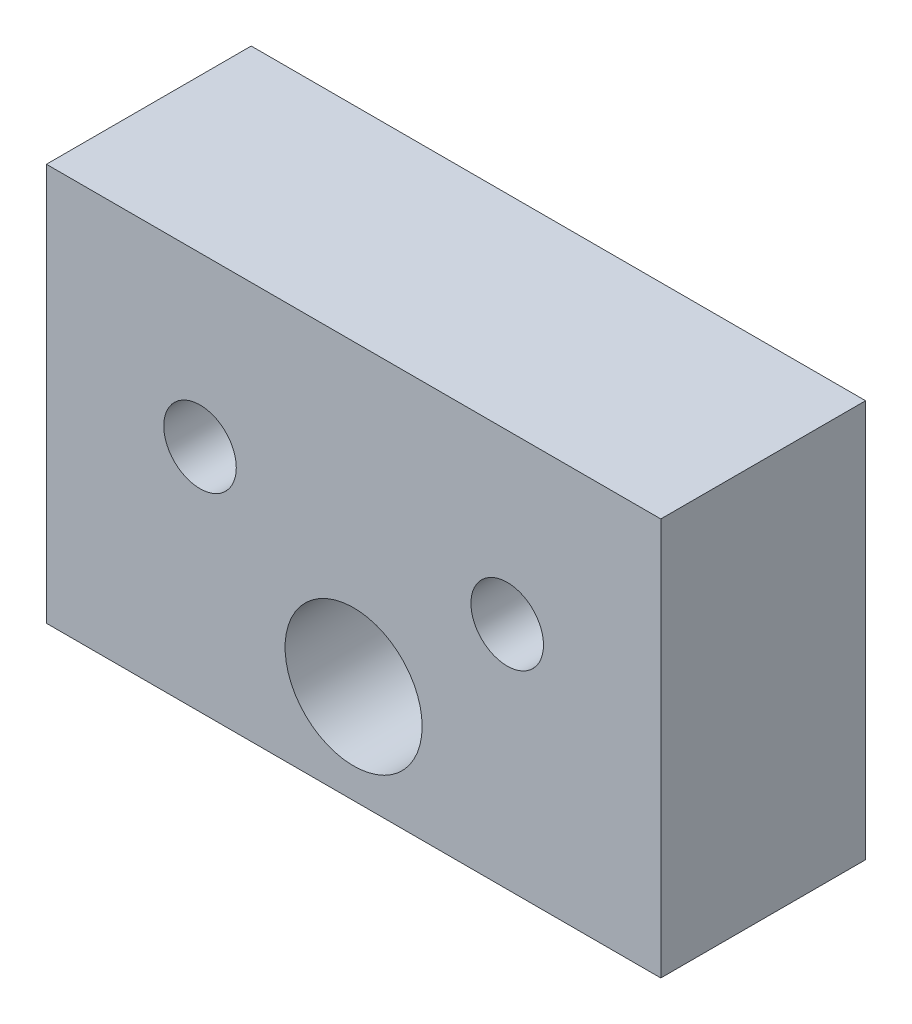
ISO-10303-21;
HEADER;
FILE_DESCRIPTION(('STEP AP214'),'2;1');
FILE_NAME('part.step','',(''),(''),'','','');
FILE_SCHEMA(('AUTOMOTIVE_DESIGN { 1 0 10303 214 1 1 1 1 }'));
ENDSEC;
DATA;
#1=APPLICATION_CONTEXT('core data for automotive mechanical design processes');
#2=APPLICATION_PROTOCOL_DEFINITION('international standard','automotive_design',2000,#1);
#3=PRODUCT_CONTEXT('',#1,'mechanical');
#4=PRODUCT('Part','Part','',(#3));
#5=PRODUCT_RELATED_PRODUCT_CATEGORY('part','',(#4));
#6=PRODUCT_DEFINITION_FORMATION('','',#4);
#7=PRODUCT_DEFINITION_CONTEXT('part definition',#1,'design');
#8=PRODUCT_DEFINITION('design','',#6,#7);
#9=PRODUCT_DEFINITION_SHAPE('','',#8);
#10=(LENGTH_UNIT() NAMED_UNIT(*) SI_UNIT(.MILLI.,.METRE.));
#11=(NAMED_UNIT(*) PLANE_ANGLE_UNIT() SI_UNIT($,.RADIAN.));
#12=(NAMED_UNIT(*) SI_UNIT($,.STERADIAN.) SOLID_ANGLE_UNIT());
#13=UNCERTAINTY_MEASURE_WITH_UNIT(LENGTH_MEASURE(1.E-05),#10,'distance_accuracy_value','');
#14=(GEOMETRIC_REPRESENTATION_CONTEXT(3) GLOBAL_UNCERTAINTY_ASSIGNED_CONTEXT((#13)) GLOBAL_UNIT_ASSIGNED_CONTEXT((#10,
#11,#12)) REPRESENTATION_CONTEXT('',''));
#15=CARTESIAN_POINT('',(0.,0.,0.));
#16=DIRECTION('',(0.,0.,1.));
#17=DIRECTION('',(1.,0.,0.));
#18=AXIS2_PLACEMENT_3D('',#15,#16,#17);
#19=CARTESIAN_POINT('',(0.,37.084,12.7));
#20=DIRECTION('',(0.,1.,0.));
#21=DIRECTION('',(0.,0.,1.));
#22=AXIS2_PLACEMENT_3D('',#19,#20,#21);
#23=PLANE('',#22);
#24=DIRECTION('',(1.,0.,0.));
#25=VECTOR('',#24,1.);
#26=CARTESIAN_POINT('',(0.,37.084,-12.7));
#27=LINE('',#26,#25);
#28=CARTESIAN_POINT('',(-38.1,37.084,-12.7));
#29=VERTEX_POINT('',#28);
#30=CARTESIAN_POINT('',(38.1,37.084,-12.7));
#31=VERTEX_POINT('',#30);
#32=EDGE_CURVE('E104',#29,#31,#27,.T.);
#33=ORIENTED_EDGE('',*,*,#32,.F.);
#34=DIRECTION('',(0.,0.,-1.));
#35=VECTOR('',#34,1.);
#36=CARTESIAN_POINT('',(-38.1,37.084,12.7));
#37=LINE('',#36,#35);
#38=CARTESIAN_POINT('',(-38.1,37.084,12.7));
#39=VERTEX_POINT('',#38);
#40=EDGE_CURVE('E11',#39,#29,#37,.T.);
#41=ORIENTED_EDGE('',*,*,#40,.F.);
#42=DIRECTION('',(1.,0.,0.));
#43=VECTOR('',#42,1.);
#44=CARTESIAN_POINT('',(0.,37.084,12.7));
#45=LINE('',#44,#43);
#46=CARTESIAN_POINT('',(38.1,37.084,12.7));
#47=VERTEX_POINT('',#46);
#48=EDGE_CURVE('E90',#39,#47,#45,.T.);
#49=ORIENTED_EDGE('',*,*,#48,.T.);
#50=DIRECTION('',(0.,0.,-1.));
#51=VECTOR('',#50,1.);
#52=CARTESIAN_POINT('',(38.1,37.084,12.7));
#53=LINE('',#52,#51);
#54=EDGE_CURVE('E72',#47,#31,#53,.T.);
#55=ORIENTED_EDGE('',*,*,#54,.T.);
#56=EDGE_LOOP('',(#33,#41,#49,#55));
#57=FACE_BOUND('',#56,.T.);
#58=ADVANCED_FACE('F33',(#57),#23,.T.);
#59=CARTESIAN_POINT('',(-38.1,0.,12.7));
#60=DIRECTION('',(1.,0.,0.));
#61=DIRECTION('',(0.,0.,-1.));
#62=AXIS2_PLACEMENT_3D('',#59,#60,#61);
#63=PLANE('',#62);
#64=DIRECTION('',(0.,-1.,0.));
#65=VECTOR('',#64,1.);
#66=CARTESIAN_POINT('',(-38.1,0.,-12.7));
#67=LINE('',#66,#65);
#68=CARTESIAN_POINT('',(-38.1,-12.224,-12.7));
#69=VERTEX_POINT('',#68);
#70=EDGE_CURVE('E95',#29,#69,#67,.T.);
#71=ORIENTED_EDGE('',*,*,#70,.T.);
#72=DIRECTION('',(0.,0.,-1.));
#73=VECTOR('',#72,1.);
#74=CARTESIAN_POINT('',(-38.1,-12.224,12.7));
#75=LINE('',#74,#73);
#76=CARTESIAN_POINT('',(-38.1,-12.224,12.7));
#77=VERTEX_POINT('',#76);
#78=EDGE_CURVE('E42',#77,#69,#75,.T.);
#79=ORIENTED_EDGE('',*,*,#78,.F.);
#80=DIRECTION('',(0.,-1.,0.));
#81=VECTOR('',#80,1.);
#82=CARTESIAN_POINT('',(-38.1,0.,12.7));
#83=LINE('',#82,#81);
#84=EDGE_CURVE('E87',#39,#77,#83,.T.);
#85=ORIENTED_EDGE('',*,*,#84,.F.);
#86=ORIENTED_EDGE('',*,*,#40,.T.);
#87=EDGE_LOOP('',(#71,#79,#85,#86));
#88=FACE_BOUND('',#87,.T.);
#89=ADVANCED_FACE('F93',(#88),#63,.F.);
#90=CARTESIAN_POINT('',(0.,-12.224,12.7));
#91=DIRECTION('',(0.,1.,0.));
#92=DIRECTION('',(0.,0.,1.));
#93=AXIS2_PLACEMENT_3D('',#90,#91,#92);
#94=PLANE('',#93);
#95=DIRECTION('',(1.,0.,0.));
#96=VECTOR('',#95,1.);
#97=CARTESIAN_POINT('',(0.,-12.224,-12.7));
#98=LINE('',#97,#96);
#99=CARTESIAN_POINT('',(38.1,-12.224,-12.7));
#100=VERTEX_POINT('',#99);
#101=EDGE_CURVE('E101',#69,#100,#98,.T.);
#102=ORIENTED_EDGE('',*,*,#101,.T.);
#103=DIRECTION('',(0.,0.,-1.));
#104=VECTOR('',#103,1.);
#105=CARTESIAN_POINT('',(38.1,-12.224,12.7));
#106=LINE('',#105,#104);
#107=CARTESIAN_POINT('',(38.1,-12.224,12.7));
#108=VERTEX_POINT('',#107);
#109=EDGE_CURVE('E86',#108,#100,#106,.T.);
#110=ORIENTED_EDGE('',*,*,#109,.F.);
#111=DIRECTION('',(1.,0.,0.));
#112=VECTOR('',#111,1.);
#113=CARTESIAN_POINT('',(0.,-12.224,12.7));
#114=LINE('',#113,#112);
#115=EDGE_CURVE('E80',#77,#108,#114,.T.);
#116=ORIENTED_EDGE('',*,*,#115,.F.);
#117=ORIENTED_EDGE('',*,*,#78,.T.);
#118=EDGE_LOOP('',(#102,#110,#116,#117));
#119=FACE_BOUND('',#118,.T.);
#120=ADVANCED_FACE('F83',(#119),#94,.F.);
#121=CARTESIAN_POINT('',(0.,0.,12.7));
#122=DIRECTION('',(0.,0.,-1.));
#123=DIRECTION('',(-1.,0.,0.));
#124=AXIS2_PLACEMENT_3D('',#121,#122,#123);
#125=CYLINDRICAL_SURFACE('',#124,8.5);
#126=CARTESIAN_POINT('',(0.,0.,12.7));
#127=DIRECTION('',(0.,0.,1.));
#128=DIRECTION('',(1.,0.,0.));
#129=AXIS2_PLACEMENT_3D('',#126,#127,#128);
#130=CIRCLE('',#129,8.5);
#131=CARTESIAN_POINT('',(8.5,0.,12.7));
#132=VERTEX_POINT('',#131);
#133=EDGE_CURVE('E117',#132,#132,#130,.T.);
#134=ORIENTED_EDGE('',*,*,#133,.T.);
#135=EDGE_LOOP('',(#134));
#136=FACE_BOUND('',#135,.T.);
#137=CARTESIAN_POINT('',(0.,0.,-12.7));
#138=DIRECTION('',(0.,0.,1.));
#139=DIRECTION('',(1.,0.,0.));
#140=AXIS2_PLACEMENT_3D('',#137,#138,#139);
#141=CIRCLE('',#140,8.5);
#142=CARTESIAN_POINT('',(8.5,0.,-12.7));
#143=VERTEX_POINT('',#142);
#144=EDGE_CURVE('E106',#143,#143,#141,.T.);
#145=ORIENTED_EDGE('',*,*,#144,.F.);
#146=EDGE_LOOP('',(#145));
#147=FACE_BOUND('',#146,.T.);
#148=ADVANCED_FACE('F137',(#136,#147),#125,.F.);
#149=CARTESIAN_POINT('',(19.05,16.256,12.7));
#150=DIRECTION('',(0.,0.,-1.));
#151=DIRECTION('',(-1.,0.,0.));
#152=AXIS2_PLACEMENT_3D('',#149,#150,#151);
#153=CYLINDRICAL_SURFACE('',#152,4.5);
#154=CARTESIAN_POINT('',(19.05,16.256,12.7));
#155=DIRECTION('',(0.,0.,1.));
#156=DIRECTION('',(1.,0.,0.));
#157=AXIS2_PLACEMENT_3D('',#154,#155,#156);
#158=CIRCLE('',#157,4.5);
#159=CARTESIAN_POINT('',(23.55,16.256,12.7));
#160=VERTEX_POINT('',#159);
#161=EDGE_CURVE('E120',#160,#160,#158,.T.);
#162=ORIENTED_EDGE('',*,*,#161,.T.);
#163=EDGE_LOOP('',(#162));
#164=FACE_BOUND('',#163,.T.);
#165=CARTESIAN_POINT('',(19.05,16.256,-12.7));
#166=DIRECTION('',(0.,0.,1.));
#167=DIRECTION('',(1.,0.,0.));
#168=AXIS2_PLACEMENT_3D('',#165,#166,#167);
#169=CIRCLE('',#168,4.5);
#170=CARTESIAN_POINT('',(23.55,16.256,-12.7));
#171=VERTEX_POINT('',#170);
#172=EDGE_CURVE('E109',#171,#171,#169,.T.);
#173=ORIENTED_EDGE('',*,*,#172,.F.);
#174=EDGE_LOOP('',(#173));
#175=FACE_BOUND('',#174,.T.);
#176=ADVANCED_FACE('F140',(#164,#175),#153,.F.);
#177=CARTESIAN_POINT('',(-19.05,16.256,12.7));
#178=DIRECTION('',(0.,0.,-1.));
#179=DIRECTION('',(-1.,0.,0.));
#180=AXIS2_PLACEMENT_3D('',#177,#178,#179);
#181=CYLINDRICAL_SURFACE('',#180,4.5);
#182=CARTESIAN_POINT('',(-19.05,16.256,12.7));
#183=DIRECTION('',(0.,0.,1.));
#184=DIRECTION('',(1.,0.,0.));
#185=AXIS2_PLACEMENT_3D('',#182,#183,#184);
#186=CIRCLE('',#185,4.5);
#187=CARTESIAN_POINT('',(-14.55,16.256,12.7));
#188=VERTEX_POINT('',#187);
#189=EDGE_CURVE('E100',#188,#188,#186,.T.);
#190=ORIENTED_EDGE('',*,*,#189,.T.);
#191=EDGE_LOOP('',(#190));
#192=FACE_BOUND('',#191,.T.);
#193=CARTESIAN_POINT('',(-19.05,16.256,-12.7));
#194=DIRECTION('',(0.,0.,1.));
#195=DIRECTION('',(1.,0.,0.));
#196=AXIS2_PLACEMENT_3D('',#193,#194,#195);
#197=CIRCLE('',#196,4.5);
#198=CARTESIAN_POINT('',(-14.55,16.256,-12.7));
#199=VERTEX_POINT('',#198);
#200=EDGE_CURVE('E112',#199,#199,#197,.T.);
#201=ORIENTED_EDGE('',*,*,#200,.F.);
#202=EDGE_LOOP('',(#201));
#203=FACE_BOUND('',#202,.T.);
#204=ADVANCED_FACE('F35',(#192,#203),#181,.F.);
#205=CARTESIAN_POINT('',(38.1,0.,12.7));
#206=DIRECTION('',(-1.,0.,0.));
#207=DIRECTION('',(0.,0.,1.));
#208=AXIS2_PLACEMENT_3D('',#205,#206,#207);
#209=PLANE('',#208);
#210=DIRECTION('',(0.,1.,0.));
#211=VECTOR('',#210,1.);
#212=CARTESIAN_POINT('',(38.1,0.,-12.7));
#213=LINE('',#212,#211);
#214=EDGE_CURVE('E65',#100,#31,#213,.T.);
#215=ORIENTED_EDGE('',*,*,#214,.T.);
#216=ORIENTED_EDGE('',*,*,#54,.F.);
#217=DIRECTION('',(0.,1.,0.));
#218=VECTOR('',#217,1.);
#219=CARTESIAN_POINT('',(38.1,0.,12.7));
#220=LINE('',#219,#218);
#221=EDGE_CURVE('E50',#108,#47,#220,.T.);
#222=ORIENTED_EDGE('',*,*,#221,.F.);
#223=ORIENTED_EDGE('',*,*,#109,.T.);
#224=EDGE_LOOP('',(#215,#216,#222,#223));
#225=FACE_BOUND('',#224,.T.);
#226=ADVANCED_FACE('F131',(#225),#209,.F.);
#227=CARTESIAN_POINT('',(0.,0.,12.7));
#228=DIRECTION('',(0.,0.,1.));
#229=DIRECTION('',(1.,0.,0.));
#230=AXIS2_PLACEMENT_3D('',#227,#228,#229);
#231=PLANE('',#230);
#232=ORIENTED_EDGE('',*,*,#189,.F.);
#233=EDGE_LOOP('',(#232));
#234=FACE_BOUND('',#233,.T.);
#235=ORIENTED_EDGE('',*,*,#161,.F.);
#236=EDGE_LOOP('',(#235));
#237=FACE_BOUND('',#236,.T.);
#238=ORIENTED_EDGE('',*,*,#133,.F.);
#239=EDGE_LOOP('',(#238));
#240=FACE_BOUND('',#239,.T.);
#241=ORIENTED_EDGE('',*,*,#48,.F.);
#242=ORIENTED_EDGE('',*,*,#84,.T.);
#243=ORIENTED_EDGE('',*,*,#115,.T.);
#244=ORIENTED_EDGE('',*,*,#221,.T.);
#245=EDGE_LOOP('',(#241,#242,#243,#244));
#246=FACE_BOUND('',#245,.T.);
#247=ADVANCED_FACE('F89',(#234,#237,#240,#246),#231,.T.);
#248=CARTESIAN_POINT('',(0.,0.,-12.7));
#249=DIRECTION('',(0.,0.,1.));
#250=DIRECTION('',(1.,0.,0.));
#251=AXIS2_PLACEMENT_3D('',#248,#249,#250);
#252=PLANE('',#251);
#253=ORIENTED_EDGE('',*,*,#200,.T.);
#254=EDGE_LOOP('',(#253));
#255=FACE_BOUND('',#254,.T.);
#256=ORIENTED_EDGE('',*,*,#172,.T.);
#257=EDGE_LOOP('',(#256));
#258=FACE_BOUND('',#257,.T.);
#259=ORIENTED_EDGE('',*,*,#144,.T.);
#260=EDGE_LOOP('',(#259));
#261=FACE_BOUND('',#260,.T.);
#262=ORIENTED_EDGE('',*,*,#32,.T.);
#263=ORIENTED_EDGE('',*,*,#214,.F.);
#264=ORIENTED_EDGE('',*,*,#101,.F.);
#265=ORIENTED_EDGE('',*,*,#70,.F.);
#266=EDGE_LOOP('',(#262,#263,#264,#265));
#267=FACE_BOUND('',#266,.T.);
#268=ADVANCED_FACE('F130',(#255,#258,#261,#267),#252,.F.);
#269=CLOSED_SHELL('',(#58,#89,#120,#148,#176,#204,#226,#247,#268));
#270=MANIFOLD_SOLID_BREP('B2',#269);
#271=ADVANCED_BREP_SHAPE_REPRESENTATION('',(#18,#270),#14);
#272=SHAPE_DEFINITION_REPRESENTATION(#9,#271);
ENDSEC;
END-ISO-10303-21;
